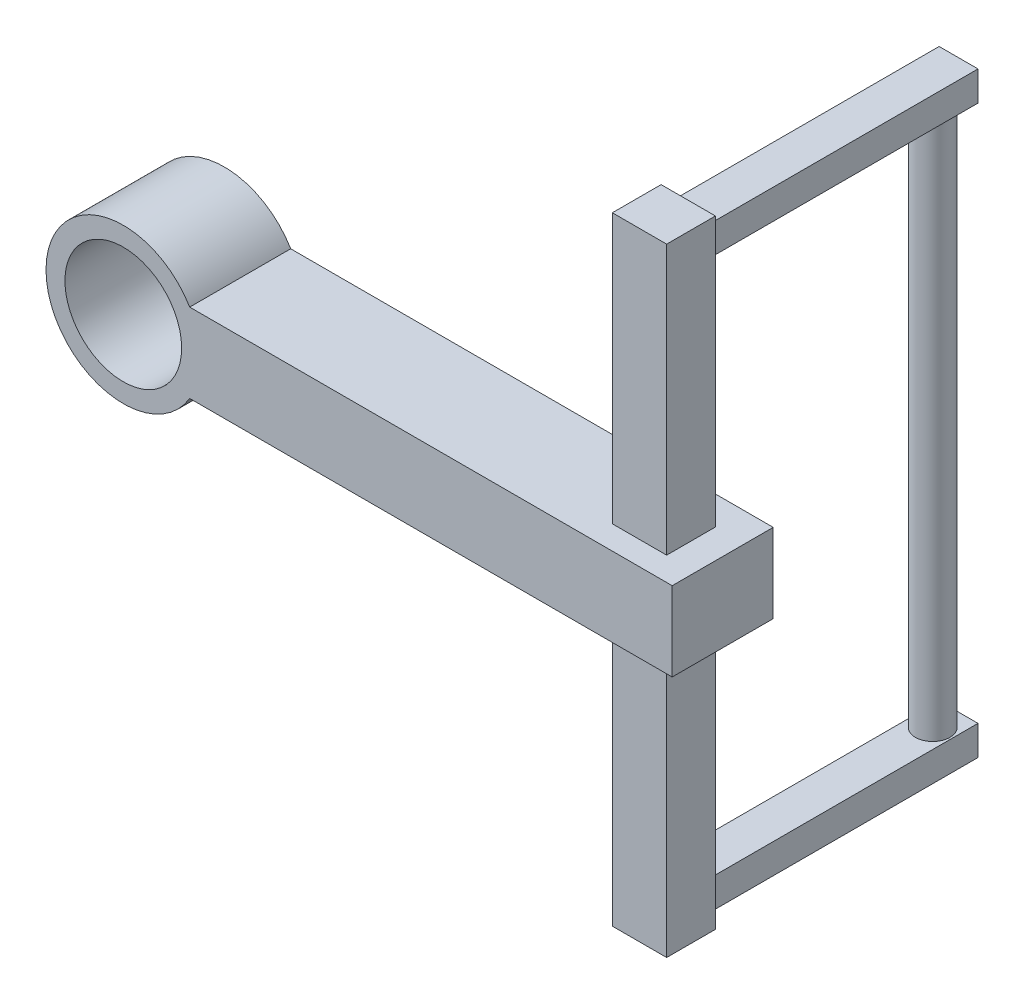
ISO-10303-21;
HEADER;
FILE_DESCRIPTION(('STEP AP214'),'2;1');
FILE_NAME('part.step','',(''),(''),'','','');
FILE_SCHEMA(('AUTOMOTIVE_DESIGN { 1 0 10303 214 1 1 1 1 }'));
ENDSEC;
DATA;
#1=APPLICATION_CONTEXT('core data for automotive mechanical design processes');
#2=APPLICATION_PROTOCOL_DEFINITION('international standard','automotive_design',2000,#1);
#3=PRODUCT_CONTEXT('',#1,'mechanical');
#4=PRODUCT('Part','Part','',(#3));
#5=PRODUCT_RELATED_PRODUCT_CATEGORY('part','',(#4));
#6=PRODUCT_DEFINITION_FORMATION('','',#4);
#7=PRODUCT_DEFINITION_CONTEXT('part definition',#1,'design');
#8=PRODUCT_DEFINITION('design','',#6,#7);
#9=PRODUCT_DEFINITION_SHAPE('','',#8);
#10=(LENGTH_UNIT() NAMED_UNIT(*) SI_UNIT(.MILLI.,.METRE.));
#11=(NAMED_UNIT(*) PLANE_ANGLE_UNIT() SI_UNIT($,.RADIAN.));
#12=(NAMED_UNIT(*) SI_UNIT($,.STERADIAN.) SOLID_ANGLE_UNIT());
#13=UNCERTAINTY_MEASURE_WITH_UNIT(LENGTH_MEASURE(1.E-05),#10,'distance_accuracy_value','');
#14=(GEOMETRIC_REPRESENTATION_CONTEXT(3) GLOBAL_UNCERTAINTY_ASSIGNED_CONTEXT((#13)) GLOBAL_UNIT_ASSIGNED_CONTEXT((#10,
#11,#12)) REPRESENTATION_CONTEXT('',''));
#15=CARTESIAN_POINT('',(0.,0.,0.));
#16=DIRECTION('',(0.,0.,1.));
#17=DIRECTION('',(1.,0.,0.));
#18=AXIS2_PLACEMENT_3D('',#15,#16,#17);
#19=CARTESIAN_POINT('',(138.216534688218,91.745451967678,8.49303455551685));
#20=DIRECTION('',(0.,0.,1.));
#21=DIRECTION('',(1.,0.,0.));
#22=AXIS2_PLACEMENT_3D('',#19,#20,#21);
#23=PLANE('',#22);
#24=DIRECTION('',(-1.,0.,0.));
#25=VECTOR('',#24,1.);
#26=CARTESIAN_POINT('',(138.216534688218,11.745451967678,8.49303455551685));
#27=LINE('',#26,#25);
#28=CARTESIAN_POINT('',(154.346477198486,11.745451967678,8.49303455551685));
#29=VERTEX_POINT('',#28);
#30=CARTESIAN_POINT('',(138.216534688218,11.745451967678,8.49303455551685));
#31=VERTEX_POINT('',#30);
#32=EDGE_CURVE('E279',#29,#31,#27,.T.);
#33=ORIENTED_EDGE('',*,*,#32,.T.);
#34=DIRECTION('',(0.,-1.,0.));
#35=VECTOR('',#34,1.);
#36=CARTESIAN_POINT('',(138.216534688218,91.745451967678,8.49303455551685));
#37=LINE('',#36,#35);
#38=CARTESIAN_POINT('',(138.216534688218,91.745451967678,8.49303455551685));
#39=VERTEX_POINT('',#38);
#40=EDGE_CURVE('E285',#39,#31,#37,.T.);
#41=ORIENTED_EDGE('',*,*,#40,.F.);
#42=DIRECTION('',(-1.,0.,0.));
#43=VECTOR('',#42,1.);
#44=CARTESIAN_POINT('',(138.216534688218,91.745451967678,8.49303455551685));
#45=LINE('',#44,#43);
#46=CARTESIAN_POINT('',(154.346477198486,91.745451967678,8.49303455551685));
#47=VERTEX_POINT('',#46);
#48=EDGE_CURVE('E283',#47,#39,#45,.T.);
#49=ORIENTED_EDGE('',*,*,#48,.F.);
#50=DIRECTION('',(0.,-1.,0.));
#51=VECTOR('',#50,1.);
#52=CARTESIAN_POINT('',(154.346477198486,91.745451967678,8.49303455551685));
#53=LINE('',#52,#51);
#54=EDGE_CURVE('E298',#47,#29,#53,.T.);
#55=ORIENTED_EDGE('',*,*,#54,.T.);
#56=EDGE_LOOP('',(#33,#41,#49,#55));
#57=FACE_BOUND('',#56,.T.);
#58=DIRECTION('',(0.,-1.,0.));
#59=VECTOR('',#58,1.);
#60=CARTESIAN_POINT('',(152.330234384702,88.5592625259168,8.49303455551685));
#61=LINE('',#60,#59);
#62=CARTESIAN_POINT('',(152.330234384702,88.5592625259168,8.49303455551685));
#63=VERTEX_POINT('',#62);
#64=CARTESIAN_POINT('',(152.330234384702,79.7611120657707,8.49303455551685));
#65=VERTEX_POINT('',#64);
#66=EDGE_CURVE('E241',#63,#65,#61,.T.);
#67=ORIENTED_EDGE('',*,*,#66,.F.);
#68=DIRECTION('',(1.,0.,0.));
#69=VECTOR('',#68,1.);
#70=CARTESIAN_POINT('',(152.330234384702,88.5592625259168,8.49303455551685));
#71=LINE('',#70,#69);
#72=CARTESIAN_POINT('',(140.78266190576,88.5592625259168,8.49303455551685));
#73=VERTEX_POINT('',#72);
#74=EDGE_CURVE('E246',#73,#63,#71,.T.);
#75=ORIENTED_EDGE('',*,*,#74,.F.);
#76=DIRECTION('',(0.,1.,0.));
#77=VECTOR('',#76,1.);
#78=CARTESIAN_POINT('',(140.78266190576,88.5592625259168,8.49303455551685));
#79=LINE('',#78,#77);
#80=CARTESIAN_POINT('',(140.78266190576,79.7611120657707,8.49303455551685));
#81=VERTEX_POINT('',#80);
#82=EDGE_CURVE('E258',#81,#73,#79,.T.);
#83=ORIENTED_EDGE('',*,*,#82,.F.);
#84=DIRECTION('',(-1.,0.,0.));
#85=VECTOR('',#84,1.);
#86=CARTESIAN_POINT('',(152.330234384702,79.7611120657707,8.49303455551685));
#87=LINE('',#86,#85);
#88=EDGE_CURVE('E255',#65,#81,#87,.T.);
#89=ORIENTED_EDGE('',*,*,#88,.F.);
#90=EDGE_LOOP('',(#67,#75,#83,#89));
#91=FACE_BOUND('',#90,.T.);
#92=ADVANCED_FACE('F33',(#57,#91),#23,.F.);
#93=CARTESIAN_POINT('',(19.7215000667531,11.745451967678,30.));
#94=DIRECTION('',(0.,-1.,0.));
#95=DIRECTION('',(0.,0.,-1.));
#96=AXIS2_PLACEMENT_3D('',#93,#94,#95);
#97=PLANE('',#96);
#98=DIRECTION('',(-1.,0.,0.));
#99=VECTOR('',#98,1.);
#100=CARTESIAN_POINT('',(19.7215000667531,11.745451967678,0.));
#101=LINE('',#100,#99);
#102=CARTESIAN_POINT('',(163.015891700564,11.745451967678,0.));
#103=VERTEX_POINT('',#102);
#104=CARTESIAN_POINT('',(19.7215000667531,11.745451967678,0.));
#105=VERTEX_POINT('',#104);
#106=EDGE_CURVE('E318',#103,#105,#101,.T.);
#107=ORIENTED_EDGE('',*,*,#106,.T.);
#108=DIRECTION('',(0.,0.,-1.));
#109=VECTOR('',#108,1.);
#110=CARTESIAN_POINT('',(19.7215000667531,11.745451967678,30.));
#111=LINE('',#110,#109);
#112=CARTESIAN_POINT('',(19.7215000667531,11.745451967678,30.));
#113=VERTEX_POINT('',#112);
#114=EDGE_CURVE('E324',#113,#105,#111,.T.);
#115=ORIENTED_EDGE('',*,*,#114,.F.);
#116=DIRECTION('',(-1.,0.,0.));
#117=VECTOR('',#116,1.);
#118=CARTESIAN_POINT('',(19.7215000667531,11.745451967678,30.));
#119=LINE('',#118,#117);
#120=CARTESIAN_POINT('',(163.015891700564,11.745451967678,30.));
#121=VERTEX_POINT('',#120);
#122=EDGE_CURVE('E322',#121,#113,#119,.T.);
#123=ORIENTED_EDGE('',*,*,#122,.F.);
#124=DIRECTION('',(0.,0.,-1.));
#125=VECTOR('',#124,1.);
#126=CARTESIAN_POINT('',(163.015891700564,11.745451967678,30.));
#127=LINE('',#126,#125);
#128=EDGE_CURVE('E334',#121,#103,#127,.T.);
#129=ORIENTED_EDGE('',*,*,#128,.T.);
#130=EDGE_LOOP('',(#107,#115,#123,#129));
#131=FACE_BOUND('',#130,.T.);
#132=DIRECTION('',(0.,0.,1.));
#133=VECTOR('',#132,1.);
#134=CARTESIAN_POINT('',(138.216534688218,11.745451967678,8.49303455551685));
#135=LINE('',#134,#133);
#136=CARTESIAN_POINT('',(138.216534688218,11.745451967678,22.9733238545073));
#137=VERTEX_POINT('',#136);
#138=EDGE_CURVE('E274',#31,#137,#135,.T.);
#139=ORIENTED_EDGE('',*,*,#138,.F.);
#140=ORIENTED_EDGE('',*,*,#32,.F.);
#141=DIRECTION('',(0.,0.,-1.));
#142=VECTOR('',#141,1.);
#143=CARTESIAN_POINT('',(154.346477198486,11.745451967678,8.49303455551685));
#144=LINE('',#143,#142);
#145=CARTESIAN_POINT('',(154.346477198486,11.745451967678,22.9733238545073));
#146=VERTEX_POINT('',#145);
#147=EDGE_CURVE('E291',#146,#29,#144,.T.);
#148=ORIENTED_EDGE('',*,*,#147,.F.);
#149=DIRECTION('',(1.,0.,0.));
#150=VECTOR('',#149,1.);
#151=CARTESIAN_POINT('',(138.216534688218,11.745451967678,22.9733238545073));
#152=LINE('',#151,#150);
#153=EDGE_CURVE('E288',#137,#146,#152,.T.);
#154=ORIENTED_EDGE('',*,*,#153,.F.);
#155=EDGE_LOOP('',(#139,#140,#148,#154));
#156=FACE_BOUND('',#155,.T.);
#157=ADVANCED_FACE('F358',(#131,#156),#97,.F.);
#158=CARTESIAN_POINT('',(0.,0.,30.));
#159=DIRECTION('',(0.,0.,1.));
#160=DIRECTION('',(1.,0.,0.));
#161=AXIS2_PLACEMENT_3D('',#158,#159,#160);
#162=PLANE('',#161);
#163=CARTESIAN_POINT('',(0.,0.,30.));
#164=DIRECTION('',(0.,0.,1.));
#165=DIRECTION('',(1.,0.,0.));
#166=AXIS2_PLACEMENT_3D('',#163,#164,#165);
#167=CIRCLE('',#166,22.9541544563936);
#168=CARTESIAN_POINT('',(19.7215000667531,-11.745451967678,30.));
#169=VERTEX_POINT('',#168);
#170=EDGE_CURVE('E314',#113,#169,#167,.T.);
#171=ORIENTED_EDGE('',*,*,#170,.T.);
#172=DIRECTION('',(1.,0.,0.));
#173=VECTOR('',#172,1.);
#174=CARTESIAN_POINT('',(19.7215000667531,-11.745451967678,30.));
#175=LINE('',#174,#173);
#176=CARTESIAN_POINT('',(163.015891700564,-11.745451967678,30.));
#177=VERTEX_POINT('',#176);
#178=EDGE_CURVE('E317',#169,#177,#175,.T.);
#179=ORIENTED_EDGE('',*,*,#178,.T.);
#180=DIRECTION('',(0.,1.,0.));
#181=VECTOR('',#180,1.);
#182=CARTESIAN_POINT('',(163.015891700564,11.745451967678,30.));
#183=LINE('',#182,#181);
#184=EDGE_CURVE('E320',#177,#121,#183,.T.);
#185=ORIENTED_EDGE('',*,*,#184,.T.);
#186=ORIENTED_EDGE('',*,*,#122,.T.);
#187=EDGE_LOOP('',(#171,#179,#185,#186));
#188=FACE_BOUND('',#187,.T.);
#189=CARTESIAN_POINT('',(0.,0.,30.));
#190=DIRECTION('',(0.,0.,1.));
#191=DIRECTION('',(1.,0.,0.));
#192=AXIS2_PLACEMENT_3D('',#189,#190,#191);
#193=CIRCLE('',#192,17.3264000388729);
#194=CARTESIAN_POINT('',(17.3264000388729,0.,30.));
#195=VERTEX_POINT('',#194);
#196=EDGE_CURVE('E308',#195,#195,#193,.T.);
#197=ORIENTED_EDGE('',*,*,#196,.F.);
#198=EDGE_LOOP('',(#197));
#199=FACE_BOUND('',#198,.T.);
#200=ADVANCED_FACE('F361',(#188,#199),#162,.T.);
#201=CARTESIAN_POINT('',(0.,0.,0.));
#202=DIRECTION('',(0.,0.,1.));
#203=DIRECTION('',(1.,0.,0.));
#204=AXIS2_PLACEMENT_3D('',#201,#202,#203);
#205=PLANE('',#204);
#206=CARTESIAN_POINT('',(0.,0.,0.));
#207=DIRECTION('',(0.,0.,1.));
#208=DIRECTION('',(1.,0.,0.));
#209=AXIS2_PLACEMENT_3D('',#206,#207,#208);
#210=CIRCLE('',#209,22.9541544563936);
#211=CARTESIAN_POINT('',(19.7215000667531,-11.745451967678,0.));
#212=VERTEX_POINT('',#211);
#213=EDGE_CURVE('E311',#105,#212,#210,.T.);
#214=ORIENTED_EDGE('',*,*,#213,.F.);
#215=ORIENTED_EDGE('',*,*,#106,.F.);
#216=DIRECTION('',(0.,1.,0.));
#217=VECTOR('',#216,1.);
#218=CARTESIAN_POINT('',(163.015891700564,11.745451967678,0.));
#219=LINE('',#218,#217);
#220=CARTESIAN_POINT('',(163.015891700564,-11.745451967678,0.));
#221=VERTEX_POINT('',#220);
#222=EDGE_CURVE('E329',#221,#103,#219,.T.);
#223=ORIENTED_EDGE('',*,*,#222,.F.);
#224=DIRECTION('',(1.,0.,0.));
#225=VECTOR('',#224,1.);
#226=CARTESIAN_POINT('',(19.7215000667531,-11.745451967678,0.));
#227=LINE('',#226,#225);
#228=EDGE_CURVE('E327',#212,#221,#227,.T.);
#229=ORIENTED_EDGE('',*,*,#228,.F.);
#230=EDGE_LOOP('',(#214,#215,#223,#229));
#231=FACE_BOUND('',#230,.T.);
#232=CARTESIAN_POINT('',(0.,0.,0.));
#233=DIRECTION('',(0.,0.,1.));
#234=DIRECTION('',(1.,0.,0.));
#235=AXIS2_PLACEMENT_3D('',#232,#233,#234);
#236=CIRCLE('',#235,17.3264000388729);
#237=CARTESIAN_POINT('',(17.3264000388729,0.,0.));
#238=VERTEX_POINT('',#237);
#239=EDGE_CURVE('E307',#238,#238,#236,.T.);
#240=ORIENTED_EDGE('',*,*,#239,.T.);
#241=EDGE_LOOP('',(#240));
#242=FACE_BOUND('',#241,.T.);
#243=ADVANCED_FACE('F352',(#231,#242),#205,.F.);
#244=CARTESIAN_POINT('',(0.,0.,30.));
#245=DIRECTION('',(0.,0.,-1.));
#246=DIRECTION('',(-1.,0.,0.));
#247=AXIS2_PLACEMENT_3D('',#244,#245,#246);
#248=CYLINDRICAL_SURFACE('',#247,22.9541544563936);
#249=ORIENTED_EDGE('',*,*,#213,.T.);
#250=DIRECTION('',(0.,0.,-1.));
#251=VECTOR('',#250,1.);
#252=CARTESIAN_POINT('',(19.7215000667531,-11.745451967678,30.));
#253=LINE('',#252,#251);
#254=EDGE_CURVE('E37',#169,#212,#253,.T.);
#255=ORIENTED_EDGE('',*,*,#254,.F.);
#256=ORIENTED_EDGE('',*,*,#170,.F.);
#257=ORIENTED_EDGE('',*,*,#114,.T.);
#258=EDGE_LOOP('',(#249,#255,#256,#257));
#259=FACE_BOUND('',#258,.T.);
#260=ADVANCED_FACE('F35',(#259),#248,.T.);
#261=CARTESIAN_POINT('',(19.7215000667531,-11.745451967678,30.));
#262=DIRECTION('',(0.,1.,0.));
#263=DIRECTION('',(0.,0.,1.));
#264=AXIS2_PLACEMENT_3D('',#261,#262,#263);
#265=PLANE('',#264);
#266=DIRECTION('',(-1.,0.,0.));
#267=VECTOR('',#266,1.);
#268=CARTESIAN_POINT('',(138.216534688218,-11.745451967678,8.49303455551685));
#269=LINE('',#268,#267);
#270=CARTESIAN_POINT('',(154.346477198486,-11.745451967678,8.49303455551685));
#271=VERTEX_POINT('',#270);
#272=CARTESIAN_POINT('',(138.216534688218,-11.745451967678,8.49303455551685));
#273=VERTEX_POINT('',#272);
#274=EDGE_CURVE('E225',#271,#273,#269,.T.);
#275=ORIENTED_EDGE('',*,*,#274,.T.);
#276=DIRECTION('',(0.,0.,1.));
#277=VECTOR('',#276,1.);
#278=CARTESIAN_POINT('',(138.216534688218,-11.745451967678,8.49303455551685));
#279=LINE('',#278,#277);
#280=CARTESIAN_POINT('',(138.216534688218,-11.745451967678,22.9733238545073));
#281=VERTEX_POINT('',#280);
#282=EDGE_CURVE('E179',#273,#281,#279,.T.);
#283=ORIENTED_EDGE('',*,*,#282,.T.);
#284=DIRECTION('',(1.,0.,0.));
#285=VECTOR('',#284,1.);
#286=CARTESIAN_POINT('',(138.216534688218,-11.745451967678,22.9733238545073));
#287=LINE('',#286,#285);
#288=CARTESIAN_POINT('',(154.346477198486,-11.745451967678,22.9733238545073));
#289=VERTEX_POINT('',#288);
#290=EDGE_CURVE('E213',#281,#289,#287,.T.);
#291=ORIENTED_EDGE('',*,*,#290,.T.);
#292=DIRECTION('',(0.,0.,-1.));
#293=VECTOR('',#292,1.);
#294=CARTESIAN_POINT('',(154.346477198486,-11.745451967678,8.49303455551685));
#295=LINE('',#294,#293);
#296=EDGE_CURVE('E228',#289,#271,#295,.T.);
#297=ORIENTED_EDGE('',*,*,#296,.T.);
#298=EDGE_LOOP('',(#275,#283,#291,#297));
#299=FACE_BOUND('',#298,.T.);
#300=ORIENTED_EDGE('',*,*,#228,.T.);
#301=DIRECTION('',(0.,0.,-1.));
#302=VECTOR('',#301,1.);
#303=CARTESIAN_POINT('',(163.015891700564,-11.745451967678,30.));
#304=LINE('',#303,#302);
#305=EDGE_CURVE('E336',#177,#221,#304,.T.);
#306=ORIENTED_EDGE('',*,*,#305,.F.);
#307=ORIENTED_EDGE('',*,*,#178,.F.);
#308=ORIENTED_EDGE('',*,*,#254,.T.);
#309=EDGE_LOOP('',(#300,#306,#307,#308));
#310=FACE_BOUND('',#309,.T.);
#311=ADVANCED_FACE('F345',(#299,#310),#265,.F.);
#312=CARTESIAN_POINT('',(163.015891700564,11.745451967678,30.));
#313=DIRECTION('',(-1.,0.,0.));
#314=DIRECTION('',(0.,0.,1.));
#315=AXIS2_PLACEMENT_3D('',#312,#313,#314);
#316=PLANE('',#315);
#317=ORIENTED_EDGE('',*,*,#222,.T.);
#318=ORIENTED_EDGE('',*,*,#128,.F.);
#319=ORIENTED_EDGE('',*,*,#184,.F.);
#320=ORIENTED_EDGE('',*,*,#305,.T.);
#321=EDGE_LOOP('',(#317,#318,#319,#320));
#322=FACE_BOUND('',#321,.T.);
#323=ADVANCED_FACE('F355',(#322),#316,.F.);
#324=CARTESIAN_POINT('',(0.,0.,30.));
#325=DIRECTION('',(0.,0.,-1.));
#326=DIRECTION('',(-1.,0.,0.));
#327=AXIS2_PLACEMENT_3D('',#324,#325,#326);
#328=CYLINDRICAL_SURFACE('',#327,17.3264000388729);
#329=ORIENTED_EDGE('',*,*,#196,.T.);
#330=EDGE_LOOP('',(#329));
#331=FACE_BOUND('',#330,.T.);
#332=ORIENTED_EDGE('',*,*,#239,.F.);
#333=EDGE_LOOP('',(#332));
#334=FACE_BOUND('',#333,.T.);
#335=ADVANCED_FACE('F367',(#331,#334),#328,.F.);
#336=CARTESIAN_POINT('',(138.216534688218,91.745451967678,8.49303455551685));
#337=DIRECTION('',(1.,0.,0.));
#338=DIRECTION('',(0.,0.,-1.));
#339=AXIS2_PLACEMENT_3D('',#336,#337,#338);
#340=PLANE('',#339);
#341=ORIENTED_EDGE('',*,*,#138,.T.);
#342=DIRECTION('',(0.,-1.,0.));
#343=VECTOR('',#342,1.);
#344=CARTESIAN_POINT('',(138.216534688218,91.745451967678,22.9733238545073));
#345=LINE('',#344,#343);
#346=CARTESIAN_POINT('',(138.216534688218,91.745451967678,22.9733238545073));
#347=VERTEX_POINT('',#346);
#348=EDGE_CURVE('E304',#347,#137,#345,.T.);
#349=ORIENTED_EDGE('',*,*,#348,.F.);
#350=DIRECTION('',(0.,0.,1.));
#351=VECTOR('',#350,1.);
#352=CARTESIAN_POINT('',(138.216534688218,91.745451967678,8.49303455551685));
#353=LINE('',#352,#351);
#354=EDGE_CURVE('E275',#39,#347,#353,.T.);
#355=ORIENTED_EDGE('',*,*,#354,.F.);
#356=ORIENTED_EDGE('',*,*,#40,.T.);
#357=EDGE_LOOP('',(#341,#349,#355,#356));
#358=FACE_BOUND('',#357,.T.);
#359=ADVANCED_FACE('F370',(#358),#340,.F.);
#360=CARTESIAN_POINT('',(138.216534688218,91.745451967678,22.9733238545073));
#361=DIRECTION('',(0.,0.,-1.));
#362=DIRECTION('',(-1.,0.,0.));
#363=AXIS2_PLACEMENT_3D('',#360,#361,#362);
#364=PLANE('',#363);
#365=ORIENTED_EDGE('',*,*,#153,.T.);
#366=DIRECTION('',(0.,-1.,0.));
#367=VECTOR('',#366,1.);
#368=CARTESIAN_POINT('',(154.346477198486,91.745451967678,22.9733238545073));
#369=LINE('',#368,#367);
#370=CARTESIAN_POINT('',(154.346477198486,91.745451967678,22.9733238545073));
#371=VERTEX_POINT('',#370);
#372=EDGE_CURVE('E301',#371,#146,#369,.T.);
#373=ORIENTED_EDGE('',*,*,#372,.F.);
#374=DIRECTION('',(1.,0.,0.));
#375=VECTOR('',#374,1.);
#376=CARTESIAN_POINT('',(138.216534688218,91.745451967678,22.9733238545073));
#377=LINE('',#376,#375);
#378=EDGE_CURVE('E278',#347,#371,#377,.T.);
#379=ORIENTED_EDGE('',*,*,#378,.F.);
#380=ORIENTED_EDGE('',*,*,#348,.T.);
#381=EDGE_LOOP('',(#365,#373,#379,#380));
#382=FACE_BOUND('',#381,.T.);
#383=ADVANCED_FACE('F393',(#382),#364,.F.);
#384=CARTESIAN_POINT('',(154.346477198486,91.745451967678,8.49303455551685));
#385=DIRECTION('',(-1.,0.,0.));
#386=DIRECTION('',(0.,0.,1.));
#387=AXIS2_PLACEMENT_3D('',#384,#385,#386);
#388=PLANE('',#387);
#389=ORIENTED_EDGE('',*,*,#147,.T.);
#390=ORIENTED_EDGE('',*,*,#54,.F.);
#391=DIRECTION('',(0.,0.,-1.));
#392=VECTOR('',#391,1.);
#393=CARTESIAN_POINT('',(154.346477198486,91.745451967678,8.49303455551685));
#394=LINE('',#393,#392);
#395=EDGE_CURVE('E281',#371,#47,#394,.T.);
#396=ORIENTED_EDGE('',*,*,#395,.F.);
#397=ORIENTED_EDGE('',*,*,#372,.T.);
#398=EDGE_LOOP('',(#389,#390,#396,#397));
#399=FACE_BOUND('',#398,.T.);
#400=ADVANCED_FACE('F390',(#399),#388,.F.);
#401=CARTESIAN_POINT('',(0.,91.745451967678,0.));
#402=DIRECTION('',(0.,1.,0.));
#403=DIRECTION('',(0.,0.,1.));
#404=AXIS2_PLACEMENT_3D('',#401,#402,#403);
#405=PLANE('',#404);
#406=ORIENTED_EDGE('',*,*,#354,.T.);
#407=ORIENTED_EDGE('',*,*,#378,.T.);
#408=ORIENTED_EDGE('',*,*,#395,.T.);
#409=ORIENTED_EDGE('',*,*,#48,.T.);
#410=EDGE_LOOP('',(#406,#407,#408,#409));
#411=FACE_BOUND('',#410,.T.);
#412=ADVANCED_FACE('F388',(#411),#405,.T.);
#413=CARTESIAN_POINT('',(152.330234384702,88.5592625259168,-71.5069654444832));
#414=DIRECTION('',(-1.,0.,0.));
#415=DIRECTION('',(0.,0.,1.));
#416=AXIS2_PLACEMENT_3D('',#413,#414,#415);
#417=PLANE('',#416);
#418=ORIENTED_EDGE('',*,*,#66,.T.);
#419=DIRECTION('',(0.,0.,1.));
#420=VECTOR('',#419,1.);
#421=CARTESIAN_POINT('',(152.330234384702,79.7611120657707,-71.5069654444832));
#422=LINE('',#421,#420);
#423=CARTESIAN_POINT('',(152.330234384702,79.7611120657707,-71.5069654444832));
#424=VERTEX_POINT('',#423);
#425=EDGE_CURVE('E271',#424,#65,#422,.T.);
#426=ORIENTED_EDGE('',*,*,#425,.F.);
#427=DIRECTION('',(0.,-1.,0.));
#428=VECTOR('',#427,1.);
#429=CARTESIAN_POINT('',(152.330234384702,88.5592625259168,-71.5069654444832));
#430=LINE('',#429,#428);
#431=CARTESIAN_POINT('',(152.330234384702,88.5592625259168,-71.5069654444832));
#432=VERTEX_POINT('',#431);
#433=EDGE_CURVE('E242',#432,#424,#430,.T.);
#434=ORIENTED_EDGE('',*,*,#433,.F.);
#435=DIRECTION('',(0.,0.,1.));
#436=VECTOR('',#435,1.);
#437=CARTESIAN_POINT('',(152.330234384702,88.5592625259168,-71.5069654444832));
#438=LINE('',#437,#436);
#439=EDGE_CURVE('E252',#432,#63,#438,.T.);
#440=ORIENTED_EDGE('',*,*,#439,.T.);
#441=EDGE_LOOP('',(#418,#426,#434,#440));
#442=FACE_BOUND('',#441,.T.);
#443=ADVANCED_FACE('F411',(#442),#417,.F.);
#444=CARTESIAN_POINT('',(152.330234384702,79.7611120657707,-71.5069654444832));
#445=DIRECTION('',(0.,1.,0.));
#446=DIRECTION('',(0.,0.,1.));
#447=AXIS2_PLACEMENT_3D('',#444,#445,#446);
#448=PLANE('',#447);
#449=CARTESIAN_POINT('',(146.648095545858,79.7611120657707,-63.7361136160799));
#450=DIRECTION('',(0.,1.,0.));
#451=DIRECTION('',(0.,0.,1.));
#452=AXIS2_PLACEMENT_3D('',#449,#450,#451);
#453=CIRCLE('',#452,5.13552651347633);
#454=CARTESIAN_POINT('',(146.648095545858,79.7611120657707,-58.6005871026036));
#455=VERTEX_POINT('',#454);
#456=EDGE_CURVE('E11',#455,#455,#453,.F.);
#457=ORIENTED_EDGE('',*,*,#456,.F.);
#458=EDGE_LOOP('',(#457));
#459=FACE_BOUND('',#458,.T.);
#460=ORIENTED_EDGE('',*,*,#88,.T.);
#461=DIRECTION('',(0.,0.,1.));
#462=VECTOR('',#461,1.);
#463=CARTESIAN_POINT('',(140.78266190576,79.7611120657707,-71.5069654444832));
#464=LINE('',#463,#462);
#465=CARTESIAN_POINT('',(140.78266190576,79.7611120657707,-71.5069654444832));
#466=VERTEX_POINT('',#465);
#467=EDGE_CURVE('E268',#466,#81,#464,.T.);
#468=ORIENTED_EDGE('',*,*,#467,.F.);
#469=DIRECTION('',(-1.,0.,0.));
#470=VECTOR('',#469,1.);
#471=CARTESIAN_POINT('',(152.330234384702,79.7611120657707,-71.5069654444832));
#472=LINE('',#471,#470);
#473=EDGE_CURVE('E245',#424,#466,#472,.T.);
#474=ORIENTED_EDGE('',*,*,#473,.F.);
#475=ORIENTED_EDGE('',*,*,#425,.T.);
#476=EDGE_LOOP('',(#460,#468,#474,#475));
#477=FACE_BOUND('',#476,.T.);
#478=ADVANCED_FACE('F415',(#459,#477),#448,.F.);
#479=CARTESIAN_POINT('',(140.78266190576,88.5592625259168,-71.5069654444832));
#480=DIRECTION('',(1.,0.,0.));
#481=DIRECTION('',(0.,0.,-1.));
#482=AXIS2_PLACEMENT_3D('',#479,#480,#481);
#483=PLANE('',#482);
#484=ORIENTED_EDGE('',*,*,#82,.T.);
#485=DIRECTION('',(0.,0.,1.));
#486=VECTOR('',#485,1.);
#487=CARTESIAN_POINT('',(140.78266190576,88.5592625259168,-71.5069654444832));
#488=LINE('',#487,#486);
#489=CARTESIAN_POINT('',(140.78266190576,88.5592625259168,-71.5069654444832));
#490=VERTEX_POINT('',#489);
#491=EDGE_CURVE('E265',#490,#73,#488,.T.);
#492=ORIENTED_EDGE('',*,*,#491,.F.);
#493=DIRECTION('',(0.,1.,0.));
#494=VECTOR('',#493,1.);
#495=CARTESIAN_POINT('',(140.78266190576,88.5592625259168,-71.5069654444832));
#496=LINE('',#495,#494);
#497=EDGE_CURVE('E248',#466,#490,#496,.T.);
#498=ORIENTED_EDGE('',*,*,#497,.F.);
#499=ORIENTED_EDGE('',*,*,#467,.T.);
#500=EDGE_LOOP('',(#484,#492,#498,#499));
#501=FACE_BOUND('',#500,.T.);
#502=ADVANCED_FACE('F420',(#501),#483,.F.);
#503=CARTESIAN_POINT('',(152.330234384702,88.5592625259168,-71.5069654444832));
#504=DIRECTION('',(0.,-1.,0.));
#505=DIRECTION('',(0.,0.,-1.));
#506=AXIS2_PLACEMENT_3D('',#503,#504,#505);
#507=PLANE('',#506);
#508=ORIENTED_EDGE('',*,*,#74,.T.);
#509=ORIENTED_EDGE('',*,*,#439,.F.);
#510=DIRECTION('',(1.,0.,0.));
#511=VECTOR('',#510,1.);
#512=CARTESIAN_POINT('',(152.330234384702,88.5592625259168,-71.5069654444832));
#513=LINE('',#512,#511);
#514=EDGE_CURVE('E250',#490,#432,#513,.T.);
#515=ORIENTED_EDGE('',*,*,#514,.F.);
#516=ORIENTED_EDGE('',*,*,#491,.T.);
#517=EDGE_LOOP('',(#508,#509,#515,#516));
#518=FACE_BOUND('',#517,.T.);
#519=ADVANCED_FACE('F426',(#518),#507,.F.);
#520=CARTESIAN_POINT('',(0.,0.,-71.5069654444832));
#521=DIRECTION('',(0.,0.,-1.));
#522=DIRECTION('',(-1.,0.,0.));
#523=AXIS2_PLACEMENT_3D('',#520,#521,#522);
#524=PLANE('',#523);
#525=ORIENTED_EDGE('',*,*,#433,.T.);
#526=ORIENTED_EDGE('',*,*,#473,.T.);
#527=ORIENTED_EDGE('',*,*,#497,.T.);
#528=ORIENTED_EDGE('',*,*,#514,.T.);
#529=EDGE_LOOP('',(#525,#526,#527,#528));
#530=FACE_BOUND('',#529,.T.);
#531=ADVANCED_FACE('F430',(#530),#524,.T.);
#532=CARTESIAN_POINT('',(138.216534688218,-91.745451967678,8.49303455551685));
#533=DIRECTION('',(-1.,0.,0.));
#534=DIRECTION('',(0.,0.,1.));
#535=AXIS2_PLACEMENT_3D('',#532,#533,#534);
#536=PLANE('',#535);
#537=ORIENTED_EDGE('',*,*,#282,.F.);
#538=DIRECTION('',(0.,1.,0.));
#539=VECTOR('',#538,1.);
#540=CARTESIAN_POINT('',(138.216534688218,-91.745451967678,8.49303455551685));
#541=LINE('',#540,#539);
#542=CARTESIAN_POINT('',(138.216534688218,-91.745451967678,8.49303455551685));
#543=VERTEX_POINT('',#542);
#544=EDGE_CURVE('E239',#543,#273,#541,.T.);
#545=ORIENTED_EDGE('',*,*,#544,.F.);
#546=DIRECTION('',(0.,0.,1.));
#547=VECTOR('',#546,1.);
#548=CARTESIAN_POINT('',(138.216534688218,-91.745451967678,8.49303455551685));
#549=LINE('',#548,#547);
#550=CARTESIAN_POINT('',(138.216534688218,-91.745451967678,22.9733238545073));
#551=VERTEX_POINT('',#550);
#552=EDGE_CURVE('E209',#543,#551,#549,.T.);
#553=ORIENTED_EDGE('',*,*,#552,.T.);
#554=DIRECTION('',(0.,1.,0.));
#555=VECTOR('',#554,1.);
#556=CARTESIAN_POINT('',(138.216534688218,-91.745451967678,22.9733238545073));
#557=LINE('',#556,#555);
#558=EDGE_CURVE('E222',#551,#281,#557,.T.);
#559=ORIENTED_EDGE('',*,*,#558,.T.);
#560=EDGE_LOOP('',(#537,#545,#553,#559));
#561=FACE_BOUND('',#560,.T.);
#562=ADVANCED_FACE('F434',(#561),#536,.T.);
#563=CARTESIAN_POINT('',(138.216534688218,-91.745451967678,8.49303455551685));
#564=DIRECTION('',(0.,0.,-1.));
#565=DIRECTION('',(-1.,0.,0.));
#566=AXIS2_PLACEMENT_3D('',#563,#564,#565);
#567=PLANE('',#566);
#568=DIRECTION('',(0.,1.,0.));
#569=VECTOR('',#568,1.);
#570=CARTESIAN_POINT('',(152.330234384702,-88.5592625259168,8.49303455551685));
#571=LINE('',#570,#569);
#572=CARTESIAN_POINT('',(152.330234384702,-88.5592625259168,8.49303455551685));
#573=VERTEX_POINT('',#572);
#574=CARTESIAN_POINT('',(152.330234384702,-79.7611120657707,8.49303455551685));
#575=VERTEX_POINT('',#574);
#576=EDGE_CURVE('E176',#573,#575,#571,.T.);
#577=ORIENTED_EDGE('',*,*,#576,.T.);
#578=DIRECTION('',(-1.,0.,0.));
#579=VECTOR('',#578,1.);
#580=CARTESIAN_POINT('',(152.330234384702,-79.7611120657707,8.49303455551685));
#581=LINE('',#580,#579);
#582=CARTESIAN_POINT('',(140.78266190576,-79.7611120657707,8.49303455551685));
#583=VERTEX_POINT('',#582);
#584=EDGE_CURVE('E190',#575,#583,#581,.T.);
#585=ORIENTED_EDGE('',*,*,#584,.T.);
#586=DIRECTION('',(0.,-1.,0.));
#587=VECTOR('',#586,1.);
#588=CARTESIAN_POINT('',(140.78266190576,-88.5592625259168,8.49303455551685));
#589=LINE('',#588,#587);
#590=CARTESIAN_POINT('',(140.78266190576,-88.5592625259168,8.49303455551685));
#591=VERTEX_POINT('',#590);
#592=EDGE_CURVE('E54',#583,#591,#589,.T.);
#593=ORIENTED_EDGE('',*,*,#592,.T.);
#594=DIRECTION('',(1.,0.,0.));
#595=VECTOR('',#594,1.);
#596=CARTESIAN_POINT('',(152.330234384702,-88.5592625259168,8.49303455551685));
#597=LINE('',#596,#595);
#598=EDGE_CURVE('E49',#591,#573,#597,.T.);
#599=ORIENTED_EDGE('',*,*,#598,.T.);
#600=EDGE_LOOP('',(#577,#585,#593,#599));
#601=FACE_BOUND('',#600,.T.);
#602=ORIENTED_EDGE('',*,*,#274,.F.);
#603=DIRECTION('',(0.,1.,0.));
#604=VECTOR('',#603,1.);
#605=CARTESIAN_POINT('',(154.346477198486,-91.745451967678,8.49303455551685));
#606=LINE('',#605,#604);
#607=CARTESIAN_POINT('',(154.346477198486,-91.745451967678,8.49303455551685));
#608=VERTEX_POINT('',#607);
#609=EDGE_CURVE('E237',#608,#271,#606,.T.);
#610=ORIENTED_EDGE('',*,*,#609,.F.);
#611=DIRECTION('',(-1.,0.,0.));
#612=VECTOR('',#611,1.);
#613=CARTESIAN_POINT('',(138.216534688218,-91.745451967678,8.49303455551685));
#614=LINE('',#613,#612);
#615=EDGE_CURVE('E212',#608,#543,#614,.T.);
#616=ORIENTED_EDGE('',*,*,#615,.T.);
#617=ORIENTED_EDGE('',*,*,#544,.T.);
#618=EDGE_LOOP('',(#602,#610,#616,#617));
#619=FACE_BOUND('',#618,.T.);
#620=ADVANCED_FACE('F438',(#601,#619),#567,.T.);
#621=CARTESIAN_POINT('',(154.346477198486,-91.745451967678,8.49303455551685));
#622=DIRECTION('',(1.,0.,0.));
#623=DIRECTION('',(0.,0.,-1.));
#624=AXIS2_PLACEMENT_3D('',#621,#622,#623);
#625=PLANE('',#624);
#626=ORIENTED_EDGE('',*,*,#296,.F.);
#627=DIRECTION('',(0.,1.,0.));
#628=VECTOR('',#627,1.);
#629=CARTESIAN_POINT('',(154.346477198486,-91.745451967678,22.9733238545073));
#630=LINE('',#629,#628);
#631=CARTESIAN_POINT('',(154.346477198486,-91.745451967678,22.9733238545073));
#632=VERTEX_POINT('',#631);
#633=EDGE_CURVE('E234',#632,#289,#630,.T.);
#634=ORIENTED_EDGE('',*,*,#633,.F.);
#635=DIRECTION('',(0.,0.,-1.));
#636=VECTOR('',#635,1.);
#637=CARTESIAN_POINT('',(154.346477198486,-91.745451967678,8.49303455551685));
#638=LINE('',#637,#636);
#639=EDGE_CURVE('E216',#632,#608,#638,.T.);
#640=ORIENTED_EDGE('',*,*,#639,.T.);
#641=ORIENTED_EDGE('',*,*,#609,.T.);
#642=EDGE_LOOP('',(#626,#634,#640,#641));
#643=FACE_BOUND('',#642,.T.);
#644=ADVANCED_FACE('F442',(#643),#625,.T.);
#645=CARTESIAN_POINT('',(138.216534688218,-91.745451967678,22.9733238545073));
#646=DIRECTION('',(0.,0.,1.));
#647=DIRECTION('',(1.,0.,0.));
#648=AXIS2_PLACEMENT_3D('',#645,#646,#647);
#649=PLANE('',#648);
#650=ORIENTED_EDGE('',*,*,#290,.F.);
#651=ORIENTED_EDGE('',*,*,#558,.F.);
#652=DIRECTION('',(1.,0.,0.));
#653=VECTOR('',#652,1.);
#654=CARTESIAN_POINT('',(138.216534688218,-91.745451967678,22.9733238545073));
#655=LINE('',#654,#653);
#656=EDGE_CURVE('E219',#551,#632,#655,.T.);
#657=ORIENTED_EDGE('',*,*,#656,.T.);
#658=ORIENTED_EDGE('',*,*,#633,.T.);
#659=EDGE_LOOP('',(#650,#651,#657,#658));
#660=FACE_BOUND('',#659,.T.);
#661=ADVANCED_FACE('F445',(#660),#649,.T.);
#662=CARTESIAN_POINT('',(0.,-91.745451967678,0.));
#663=DIRECTION('',(0.,-1.,0.));
#664=DIRECTION('',(0.,0.,1.));
#665=AXIS2_PLACEMENT_3D('',#662,#663,#664);
#666=PLANE('',#665);
#667=ORIENTED_EDGE('',*,*,#552,.F.);
#668=ORIENTED_EDGE('',*,*,#615,.F.);
#669=ORIENTED_EDGE('',*,*,#639,.F.);
#670=ORIENTED_EDGE('',*,*,#656,.F.);
#671=EDGE_LOOP('',(#667,#668,#669,#670));
#672=FACE_BOUND('',#671,.T.);
#673=ADVANCED_FACE('F449',(#672),#666,.T.);
#674=CARTESIAN_POINT('',(152.330234384702,-88.5592625259168,-71.5069654444832));
#675=DIRECTION('',(1.,0.,0.));
#676=DIRECTION('',(0.,0.,-1.));
#677=AXIS2_PLACEMENT_3D('',#674,#675,#676);
#678=PLANE('',#677);
#679=ORIENTED_EDGE('',*,*,#576,.F.);
#680=DIRECTION('',(0.,0.,1.));
#681=VECTOR('',#680,1.);
#682=CARTESIAN_POINT('',(152.330234384702,-88.5592625259168,-71.5069654444832));
#683=LINE('',#682,#681);
#684=CARTESIAN_POINT('',(152.330234384702,-88.5592625259168,-71.5069654444832));
#685=VERTEX_POINT('',#684);
#686=EDGE_CURVE('E170',#685,#573,#683,.T.);
#687=ORIENTED_EDGE('',*,*,#686,.F.);
#688=DIRECTION('',(0.,1.,0.));
#689=VECTOR('',#688,1.);
#690=CARTESIAN_POINT('',(152.330234384702,-88.5592625259168,-71.5069654444832));
#691=LINE('',#690,#689);
#692=CARTESIAN_POINT('',(152.330234384702,-79.7611120657707,-71.5069654444832));
#693=VERTEX_POINT('',#692);
#694=EDGE_CURVE('E174',#685,#693,#691,.T.);
#695=ORIENTED_EDGE('',*,*,#694,.T.);
#696=DIRECTION('',(0.,0.,1.));
#697=VECTOR('',#696,1.);
#698=CARTESIAN_POINT('',(152.330234384702,-79.7611120657707,-71.5069654444832));
#699=LINE('',#698,#697);
#700=EDGE_CURVE('E198',#693,#575,#699,.T.);
#701=ORIENTED_EDGE('',*,*,#700,.T.);
#702=EDGE_LOOP('',(#679,#687,#695,#701));
#703=FACE_BOUND('',#702,.T.);
#704=ADVANCED_FACE('F172',(#703),#678,.T.);
#705=CARTESIAN_POINT('',(152.330234384702,-88.5592625259168,-71.5069654444832));
#706=DIRECTION('',(0.,-1.,0.));
#707=DIRECTION('',(0.,0.,-1.));
#708=AXIS2_PLACEMENT_3D('',#705,#706,#707);
#709=PLANE('',#708);
#710=ORIENTED_EDGE('',*,*,#598,.F.);
#711=DIRECTION('',(0.,0.,1.));
#712=VECTOR('',#711,1.);
#713=CARTESIAN_POINT('',(140.78266190576,-88.5592625259168,-71.5069654444832));
#714=LINE('',#713,#712);
#715=CARTESIAN_POINT('',(140.78266190576,-88.5592625259168,-71.5069654444832));
#716=VERTEX_POINT('',#715);
#717=EDGE_CURVE('E180',#716,#591,#714,.T.);
#718=ORIENTED_EDGE('',*,*,#717,.F.);
#719=DIRECTION('',(1.,0.,0.));
#720=VECTOR('',#719,1.);
#721=CARTESIAN_POINT('',(152.330234384702,-88.5592625259168,-71.5069654444832));
#722=LINE('',#721,#720);
#723=EDGE_CURVE('E186',#716,#685,#722,.T.);
#724=ORIENTED_EDGE('',*,*,#723,.T.);
#725=ORIENTED_EDGE('',*,*,#686,.T.);
#726=EDGE_LOOP('',(#710,#718,#724,#725));
#727=FACE_BOUND('',#726,.T.);
#728=ADVANCED_FACE('F192',(#727),#709,.T.);
#729=CARTESIAN_POINT('',(140.78266190576,-88.5592625259168,-71.5069654444832));
#730=DIRECTION('',(-1.,0.,0.));
#731=DIRECTION('',(0.,0.,1.));
#732=AXIS2_PLACEMENT_3D('',#729,#730,#731);
#733=PLANE('',#732);
#734=ORIENTED_EDGE('',*,*,#592,.F.);
#735=DIRECTION('',(0.,0.,1.));
#736=VECTOR('',#735,1.);
#737=CARTESIAN_POINT('',(140.78266190576,-79.7611120657707,-71.5069654444832));
#738=LINE('',#737,#736);
#739=CARTESIAN_POINT('',(140.78266190576,-79.7611120657707,-71.5069654444832));
#740=VERTEX_POINT('',#739);
#741=EDGE_CURVE('E205',#740,#583,#738,.T.);
#742=ORIENTED_EDGE('',*,*,#741,.F.);
#743=DIRECTION('',(0.,-1.,0.));
#744=VECTOR('',#743,1.);
#745=CARTESIAN_POINT('',(140.78266190576,-88.5592625259168,-71.5069654444832));
#746=LINE('',#745,#744);
#747=EDGE_CURVE('E193',#740,#716,#746,.T.);
#748=ORIENTED_EDGE('',*,*,#747,.T.);
#749=ORIENTED_EDGE('',*,*,#717,.T.);
#750=EDGE_LOOP('',(#734,#742,#748,#749));
#751=FACE_BOUND('',#750,.T.);
#752=ADVANCED_FACE('F458',(#751),#733,.T.);
#753=CARTESIAN_POINT('',(152.330234384702,-79.7611120657707,-71.5069654444832));
#754=DIRECTION('',(0.,1.,0.));
#755=DIRECTION('',(0.,0.,1.));
#756=AXIS2_PLACEMENT_3D('',#753,#754,#755);
#757=PLANE('',#756);
#758=CARTESIAN_POINT('',(146.648095545858,-79.7611120657707,-63.7361136160799));
#759=DIRECTION('',(0.,1.,0.));
#760=DIRECTION('',(0.,0.,1.));
#761=AXIS2_PLACEMENT_3D('',#758,#759,#760);
#762=CIRCLE('',#761,5.13552651347633);
#763=CARTESIAN_POINT('',(146.648095545858,-79.7611120657707,-58.6005871026036));
#764=VERTEX_POINT('',#763);
#765=EDGE_CURVE('E200',#764,#764,#762,.T.);
#766=ORIENTED_EDGE('',*,*,#765,.F.);
#767=EDGE_LOOP('',(#766));
#768=FACE_BOUND('',#767,.T.);
#769=ORIENTED_EDGE('',*,*,#584,.F.);
#770=ORIENTED_EDGE('',*,*,#700,.F.);
#771=DIRECTION('',(-1.,0.,0.));
#772=VECTOR('',#771,1.);
#773=CARTESIAN_POINT('',(152.330234384702,-79.7611120657707,-71.5069654444832));
#774=LINE('',#773,#772);
#775=EDGE_CURVE('E189',#693,#740,#774,.T.);
#776=ORIENTED_EDGE('',*,*,#775,.T.);
#777=ORIENTED_EDGE('',*,*,#741,.T.);
#778=EDGE_LOOP('',(#769,#770,#776,#777));
#779=FACE_BOUND('',#778,.T.);
#780=ADVANCED_FACE('F461',(#768,#779),#757,.T.);
#781=CARTESIAN_POINT('',(0.,0.,-71.5069654444832));
#782=DIRECTION('',(0.,0.,-1.));
#783=DIRECTION('',(-1.,0.,0.));
#784=AXIS2_PLACEMENT_3D('',#781,#782,#783);
#785=PLANE('',#784);
#786=ORIENTED_EDGE('',*,*,#694,.F.);
#787=ORIENTED_EDGE('',*,*,#723,.F.);
#788=ORIENTED_EDGE('',*,*,#747,.F.);
#789=ORIENTED_EDGE('',*,*,#775,.F.);
#790=EDGE_LOOP('',(#786,#787,#788,#789));
#791=FACE_BOUND('',#790,.T.);
#792=ADVANCED_FACE('F184',(#791),#785,.T.);
#793=CARTESIAN_POINT('',(146.648095545858,82.2388879342294,-63.7361136160799));
#794=DIRECTION('',(0.,-1.,0.));
#795=DIRECTION('',(0.,0.,-1.));
#796=AXIS2_PLACEMENT_3D('',#793,#794,#795);
#797=CYLINDRICAL_SURFACE('',#796,5.13552651347633);
#798=ORIENTED_EDGE('',*,*,#765,.T.);
#799=EDGE_LOOP('',(#798));
#800=FACE_BOUND('',#799,.T.);
#801=ORIENTED_EDGE('',*,*,#456,.T.);
#802=EDGE_LOOP('',(#801));
#803=FACE_BOUND('',#802,.T.);
#804=ADVANCED_FACE('F468',(#800,#803),#797,.T.);
#805=CLOSED_SHELL('',(#92,#157,#200,#243,#260,#311,#323,#335,#359,#383,#400,#412,#443,#478,#502,
#519,#531,#562,#620,#644,#661,#673,#704,#728,#752,#780,#792,#804));
#806=MANIFOLD_SOLID_BREP('B2',#805);
#807=ADVANCED_BREP_SHAPE_REPRESENTATION('',(#18,#806),#14);
#808=SHAPE_DEFINITION_REPRESENTATION(#9,#807);
ENDSEC;
END-ISO-10303-21;
